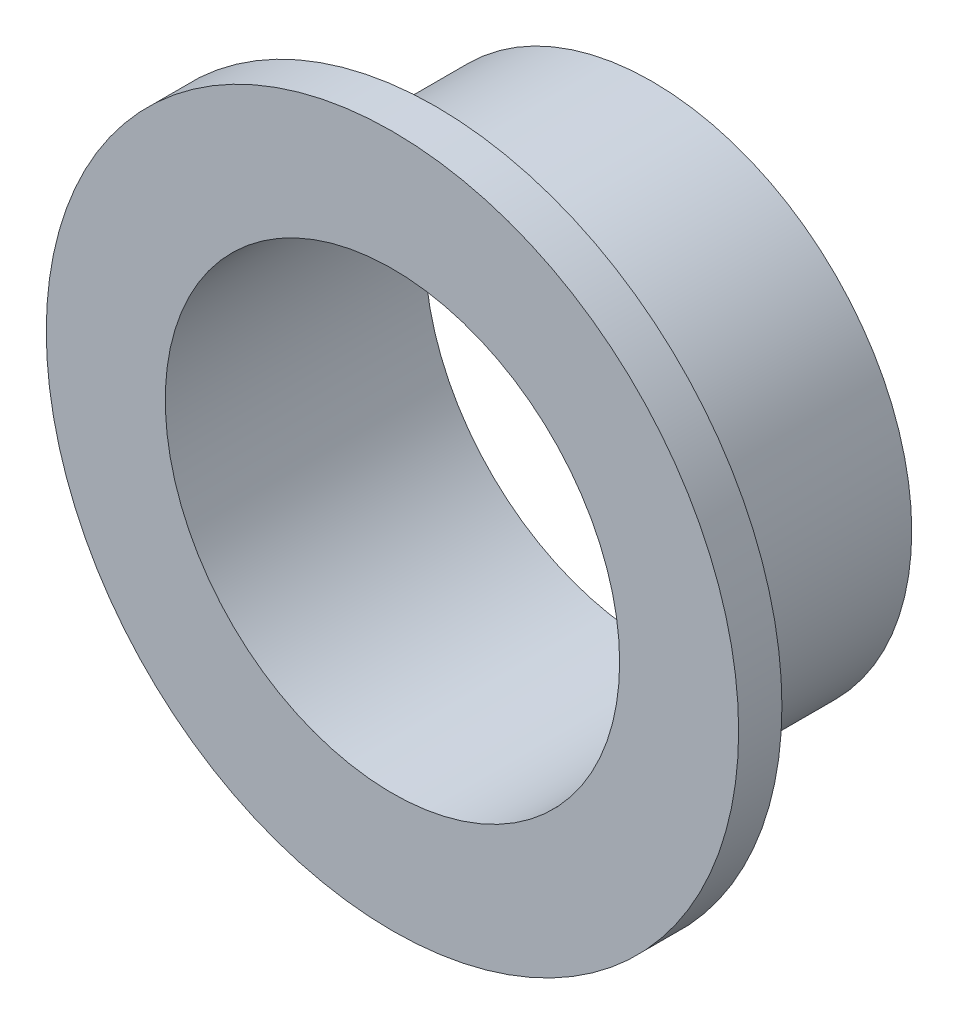
ISO-10303-21;
HEADER;
FILE_DESCRIPTION(('STEP AP214'),'2;1');
FILE_NAME('part.step','',(''),(''),'','','');
FILE_SCHEMA(('AUTOMOTIVE_DESIGN { 1 0 10303 214 1 1 1 1 }'));
ENDSEC;
DATA;
#1=APPLICATION_CONTEXT('core data for automotive mechanical design processes');
#2=APPLICATION_PROTOCOL_DEFINITION('international standard','automotive_design',2000,#1);
#3=PRODUCT_CONTEXT('',#1,'mechanical');
#4=PRODUCT('Part','Part','',(#3));
#5=PRODUCT_RELATED_PRODUCT_CATEGORY('part','',(#4));
#6=PRODUCT_DEFINITION_FORMATION('','',#4);
#7=PRODUCT_DEFINITION_CONTEXT('part definition',#1,'design');
#8=PRODUCT_DEFINITION('design','',#6,#7);
#9=PRODUCT_DEFINITION_SHAPE('','',#8);
#10=(LENGTH_UNIT() NAMED_UNIT(*) SI_UNIT(.MILLI.,.METRE.));
#11=(NAMED_UNIT(*) PLANE_ANGLE_UNIT() SI_UNIT($,.RADIAN.));
#12=(NAMED_UNIT(*) SI_UNIT($,.STERADIAN.) SOLID_ANGLE_UNIT());
#13=UNCERTAINTY_MEASURE_WITH_UNIT(LENGTH_MEASURE(1.E-05),#10,'distance_accuracy_value','');
#14=(GEOMETRIC_REPRESENTATION_CONTEXT(3) GLOBAL_UNCERTAINTY_ASSIGNED_CONTEXT((#13)) GLOBAL_UNIT_ASSIGNED_CONTEXT((#10,
#11,#12)) REPRESENTATION_CONTEXT('',''));
#15=CARTESIAN_POINT('',(0.,0.,0.));
#16=DIRECTION('',(0.,0.,1.));
#17=DIRECTION('',(1.,0.,0.));
#18=AXIS2_PLACEMENT_3D('',#15,#16,#17);
#19=CARTESIAN_POINT('',(0.,0.,0.));
#20=DIRECTION('',(0.,0.,1.));
#21=DIRECTION('',(1.,0.,0.));
#22=AXIS2_PLACEMENT_3D('',#19,#20,#21);
#23=PLANE('',#22);
#24=CARTESIAN_POINT('',(0.,0.,0.));
#25=DIRECTION('',(0.,0.,1.));
#26=DIRECTION('',(1.,0.,0.));
#27=AXIS2_PLACEMENT_3D('',#24,#25,#26);
#28=CIRCLE('',#27,6.);
#29=CARTESIAN_POINT('',(6.,0.,0.));
#30=VERTEX_POINT('',#29);
#31=EDGE_CURVE('E36',#30,#30,#28,.T.);
#32=ORIENTED_EDGE('',*,*,#31,.F.);
#33=EDGE_LOOP('',(#32));
#34=FACE_BOUND('',#33,.T.);
#35=CARTESIAN_POINT('',(0.,0.,0.));
#36=DIRECTION('',(0.,0.,1.));
#37=DIRECTION('',(1.,0.,0.));
#38=AXIS2_PLACEMENT_3D('',#35,#36,#37);
#39=CIRCLE('',#38,5.25);
#40=CARTESIAN_POINT('',(5.25,0.,0.));
#41=VERTEX_POINT('',#40);
#42=EDGE_CURVE('E43',#41,#41,#39,.T.);
#43=ORIENTED_EDGE('',*,*,#42,.T.);
#44=EDGE_LOOP('',(#43));
#45=FACE_BOUND('',#44,.T.);
#46=ADVANCED_FACE('F32',(#34,#45),#23,.F.);
#47=CARTESIAN_POINT('',(0.,0.,5.));
#48=DIRECTION('',(0.,0.,-1.));
#49=DIRECTION('',(-1.,0.,0.));
#50=AXIS2_PLACEMENT_3D('',#47,#48,#49);
#51=CYLINDRICAL_SURFACE('',#50,6.);
#52=CARTESIAN_POINT('',(0.,0.,5.));
#53=DIRECTION('',(0.,0.,1.));
#54=DIRECTION('',(1.,0.,0.));
#55=AXIS2_PLACEMENT_3D('',#52,#53,#54);
#56=CIRCLE('',#55,6.);
#57=CARTESIAN_POINT('',(6.,0.,5.));
#58=VERTEX_POINT('',#57);
#59=EDGE_CURVE('E10',#58,#58,#56,.T.);
#60=ORIENTED_EDGE('',*,*,#59,.F.);
#61=EDGE_LOOP('',(#60));
#62=FACE_BOUND('',#61,.T.);
#63=ORIENTED_EDGE('',*,*,#31,.T.);
#64=EDGE_LOOP('',(#63));
#65=FACE_BOUND('',#64,.T.);
#66=ADVANCED_FACE('F34',(#62,#65),#51,.T.);
#67=CARTESIAN_POINT('',(0.,0.,5.));
#68=DIRECTION('',(0.,0.,-1.));
#69=DIRECTION('',(-1.,0.,0.));
#70=AXIS2_PLACEMENT_3D('',#67,#68,#69);
#71=CYLINDRICAL_SURFACE('',#70,5.25);
#72=ORIENTED_EDGE('',*,*,#42,.F.);
#73=EDGE_LOOP('',(#72));
#74=FACE_BOUND('',#73,.T.);
#75=CARTESIAN_POINT('',(0.,0.,6.));
#76=DIRECTION('',(0.,0.,1.));
#77=DIRECTION('',(1.,0.,0.));
#78=AXIS2_PLACEMENT_3D('',#75,#76,#77);
#79=CIRCLE('',#78,5.25);
#80=CARTESIAN_POINT('',(5.25,0.,6.));
#81=VERTEX_POINT('',#80);
#82=EDGE_CURVE('E51',#81,#81,#79,.T.);
#83=ORIENTED_EDGE('',*,*,#82,.T.);
#84=EDGE_LOOP('',(#83));
#85=FACE_BOUND('',#84,.T.);
#86=ADVANCED_FACE('F57',(#74,#85),#71,.F.);
#87=CARTESIAN_POINT('',(0.,0.,5.));
#88=DIRECTION('',(0.,0.,1.));
#89=DIRECTION('',(1.,0.,0.));
#90=AXIS2_PLACEMENT_3D('',#87,#88,#89);
#91=PLANE('',#90);
#92=CARTESIAN_POINT('',(0.,0.,5.));
#93=DIRECTION('',(0.,0.,1.));
#94=DIRECTION('',(1.,0.,0.));
#95=AXIS2_PLACEMENT_3D('',#92,#93,#94);
#96=CIRCLE('',#95,8.);
#97=CARTESIAN_POINT('',(8.,0.,5.));
#98=VERTEX_POINT('',#97);
#99=EDGE_CURVE('E48',#98,#98,#96,.T.);
#100=ORIENTED_EDGE('',*,*,#99,.F.);
#101=EDGE_LOOP('',(#100));
#102=FACE_BOUND('',#101,.T.);
#103=ORIENTED_EDGE('',*,*,#59,.T.);
#104=EDGE_LOOP('',(#103));
#105=FACE_BOUND('',#104,.T.);
#106=ADVANCED_FACE('F62',(#102,#105),#91,.F.);
#107=CARTESIAN_POINT('',(0.,0.,6.));
#108=DIRECTION('',(0.,0.,1.));
#109=DIRECTION('',(1.,0.,0.));
#110=AXIS2_PLACEMENT_3D('',#107,#108,#109);
#111=PLANE('',#110);
#112=CARTESIAN_POINT('',(0.,0.,6.));
#113=DIRECTION('',(0.,0.,1.));
#114=DIRECTION('',(1.,0.,0.));
#115=AXIS2_PLACEMENT_3D('',#112,#113,#114);
#116=CIRCLE('',#115,8.);
#117=CARTESIAN_POINT('',(8.,0.,6.));
#118=VERTEX_POINT('',#117);
#119=EDGE_CURVE('E47',#118,#118,#116,.T.);
#120=ORIENTED_EDGE('',*,*,#119,.T.);
#121=EDGE_LOOP('',(#120));
#122=FACE_BOUND('',#121,.T.);
#123=ORIENTED_EDGE('',*,*,#82,.F.);
#124=EDGE_LOOP('',(#123));
#125=FACE_BOUND('',#124,.T.);
#126=ADVANCED_FACE('F59',(#122,#125),#111,.T.);
#127=CARTESIAN_POINT('',(0.,0.,6.));
#128=DIRECTION('',(0.,0.,-1.));
#129=DIRECTION('',(-1.,0.,0.));
#130=AXIS2_PLACEMENT_3D('',#127,#128,#129);
#131=CYLINDRICAL_SURFACE('',#130,8.);
#132=ORIENTED_EDGE('',*,*,#119,.F.);
#133=EDGE_LOOP('',(#132));
#134=FACE_BOUND('',#133,.T.);
#135=ORIENTED_EDGE('',*,*,#99,.T.);
#136=EDGE_LOOP('',(#135));
#137=FACE_BOUND('',#136,.T.);
#138=ADVANCED_FACE('F61',(#134,#137),#131,.T.);
#139=CLOSED_SHELL('',(#46,#66,#86,#106,#126,#138));
#140=MANIFOLD_SOLID_BREP('B2',#139);
#141=ADVANCED_BREP_SHAPE_REPRESENTATION('',(#18,#140),#14);
#142=SHAPE_DEFINITION_REPRESENTATION(#9,#141);
ENDSEC;
END-ISO-10303-21;
